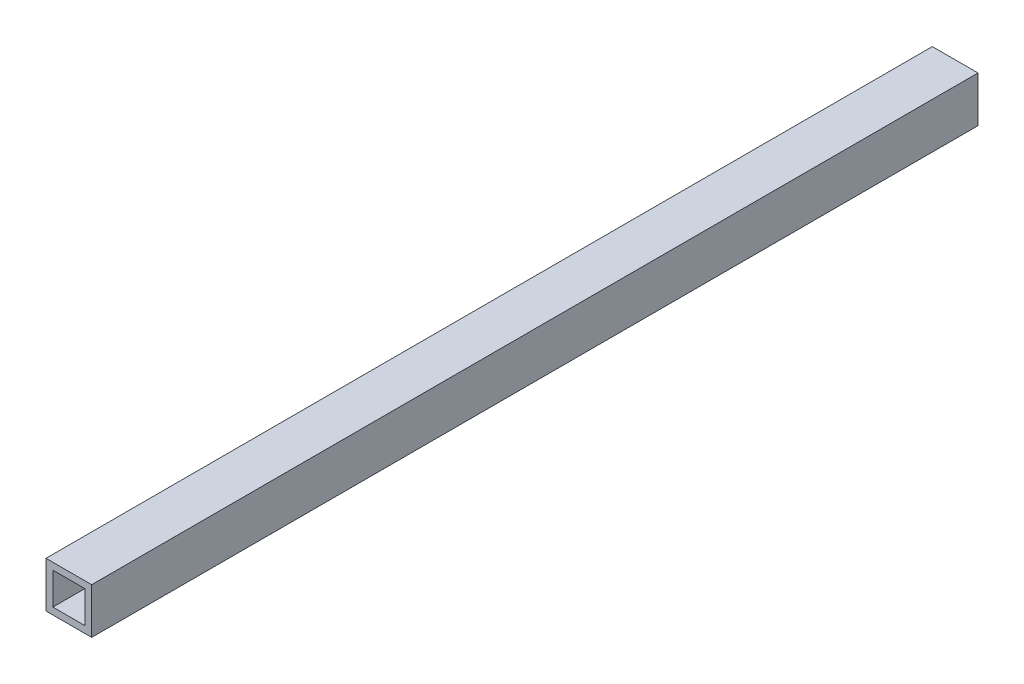
ISO-10303-21;
HEADER;
FILE_DESCRIPTION(('STEP AP214'),'2;1');
FILE_NAME('part.step','',(''),(''),'','','');
FILE_SCHEMA(('AUTOMOTIVE_DESIGN { 1 0 10303 214 1 1 1 1 }'));
ENDSEC;
DATA;
#1=APPLICATION_CONTEXT('core data for automotive mechanical design processes');
#2=APPLICATION_PROTOCOL_DEFINITION('international standard','automotive_design',2000,#1);
#3=PRODUCT_CONTEXT('',#1,'mechanical');
#4=PRODUCT('Part','Part','',(#3));
#5=PRODUCT_RELATED_PRODUCT_CATEGORY('part','',(#4));
#6=PRODUCT_DEFINITION_FORMATION('','',#4);
#7=PRODUCT_DEFINITION_CONTEXT('part definition',#1,'design');
#8=PRODUCT_DEFINITION('design','',#6,#7);
#9=PRODUCT_DEFINITION_SHAPE('','',#8);
#10=(LENGTH_UNIT() NAMED_UNIT(*) SI_UNIT(.MILLI.,.METRE.));
#11=(NAMED_UNIT(*) PLANE_ANGLE_UNIT() SI_UNIT($,.RADIAN.));
#12=(NAMED_UNIT(*) SI_UNIT($,.STERADIAN.) SOLID_ANGLE_UNIT());
#13=UNCERTAINTY_MEASURE_WITH_UNIT(LENGTH_MEASURE(1.E-05),#10,'distance_accuracy_value','');
#14=(GEOMETRIC_REPRESENTATION_CONTEXT(3) GLOBAL_UNCERTAINTY_ASSIGNED_CONTEXT((#13)) GLOBAL_UNIT_ASSIGNED_CONTEXT((#10,
#11,#12)) REPRESENTATION_CONTEXT('',''));
#15=CARTESIAN_POINT('',(0.,0.,0.));
#16=DIRECTION('',(0.,0.,1.));
#17=DIRECTION('',(1.,0.,0.));
#18=AXIS2_PLACEMENT_3D('',#15,#16,#17);
#19=CARTESIAN_POINT('',(0.,0.,194.));
#20=DIRECTION('',(0.,0.,1.));
#21=DIRECTION('',(1.,0.,0.));
#22=AXIS2_PLACEMENT_3D('',#19,#20,#21);
#23=PLANE('',#22);
#24=DIRECTION('',(0.,1.,0.));
#25=VECTOR('',#24,1.);
#26=CARTESIAN_POINT('',(5.,5.,194.));
#27=LINE('',#26,#25);
#28=CARTESIAN_POINT('',(5.,-5.,194.));
#29=VERTEX_POINT('',#28);
#30=CARTESIAN_POINT('',(5.,5.,194.));
#31=VERTEX_POINT('',#30);
#32=EDGE_CURVE('E136',#29,#31,#27,.T.);
#33=ORIENTED_EDGE('',*,*,#32,.T.);
#34=DIRECTION('',(-1.,0.,0.));
#35=VECTOR('',#34,1.);
#36=CARTESIAN_POINT('',(-5.,5.,194.));
#37=LINE('',#36,#35);
#38=CARTESIAN_POINT('',(-5.,5.,194.));
#39=VERTEX_POINT('',#38);
#40=EDGE_CURVE('E139',#31,#39,#37,.T.);
#41=ORIENTED_EDGE('',*,*,#40,.T.);
#42=DIRECTION('',(0.,-1.,0.));
#43=VECTOR('',#42,1.);
#44=CARTESIAN_POINT('',(-5.,5.,194.));
#45=LINE('',#44,#43);
#46=CARTESIAN_POINT('',(-5.,-5.,194.));
#47=VERTEX_POINT('',#46);
#48=EDGE_CURVE('E142',#39,#47,#45,.T.);
#49=ORIENTED_EDGE('',*,*,#48,.T.);
#50=DIRECTION('',(1.,0.,0.));
#51=VECTOR('',#50,1.);
#52=CARTESIAN_POINT('',(-5.,-5.,194.));
#53=LINE('',#52,#51);
#54=EDGE_CURVE('E144',#47,#29,#53,.T.);
#55=ORIENTED_EDGE('',*,*,#54,.T.);
#56=EDGE_LOOP('',(#33,#41,#49,#55));
#57=FACE_BOUND('',#56,.T.);
#58=DIRECTION('',(-1.,0.,0.));
#59=VECTOR('',#58,1.);
#60=CARTESIAN_POINT('',(-3.5,3.5,194.));
#61=LINE('',#60,#59);
#62=CARTESIAN_POINT('',(3.5,3.5,194.));
#63=VERTEX_POINT('',#62);
#64=CARTESIAN_POINT('',(-3.5,3.5,194.));
#65=VERTEX_POINT('',#64);
#66=EDGE_CURVE('E108',#63,#65,#61,.T.);
#67=ORIENTED_EDGE('',*,*,#66,.F.);
#68=DIRECTION('',(0.,1.,0.));
#69=VECTOR('',#68,1.);
#70=CARTESIAN_POINT('',(3.5,-3.5,194.));
#71=LINE('',#70,#69);
#72=CARTESIAN_POINT('',(3.5,-3.5,194.));
#73=VERTEX_POINT('',#72);
#74=EDGE_CURVE('E100',#73,#63,#71,.T.);
#75=ORIENTED_EDGE('',*,*,#74,.F.);
#76=DIRECTION('',(1.,0.,0.));
#77=VECTOR('',#76,1.);
#78=CARTESIAN_POINT('',(-3.5,-3.5,194.));
#79=LINE('',#78,#77);
#80=CARTESIAN_POINT('',(-3.5,-3.5,194.));
#81=VERTEX_POINT('',#80);
#82=EDGE_CURVE('E122',#81,#73,#79,.T.);
#83=ORIENTED_EDGE('',*,*,#82,.F.);
#84=DIRECTION('',(0.,-1.,0.));
#85=VECTOR('',#84,1.);
#86=CARTESIAN_POINT('',(-3.5,-3.5,194.));
#87=LINE('',#86,#85);
#88=EDGE_CURVE('E120',#65,#81,#87,.T.);
#89=ORIENTED_EDGE('',*,*,#88,.F.);
#90=EDGE_LOOP('',(#67,#75,#83,#89));
#91=FACE_BOUND('',#90,.T.);
#92=ADVANCED_FACE('F35',(#57,#91),#23,.T.);
#93=CARTESIAN_POINT('',(0.,0.,0.));
#94=DIRECTION('',(0.,0.,1.));
#95=DIRECTION('',(1.,0.,0.));
#96=AXIS2_PLACEMENT_3D('',#93,#94,#95);
#97=PLANE('',#96);
#98=DIRECTION('',(0.,1.,0.));
#99=VECTOR('',#98,1.);
#100=CARTESIAN_POINT('',(5.,5.,0.));
#101=LINE('',#100,#99);
#102=CARTESIAN_POINT('',(5.,-5.,0.));
#103=VERTEX_POINT('',#102);
#104=CARTESIAN_POINT('',(5.,5.,0.));
#105=VERTEX_POINT('',#104);
#106=EDGE_CURVE('E116',#103,#105,#101,.T.);
#107=ORIENTED_EDGE('',*,*,#106,.F.);
#108=DIRECTION('',(1.,0.,0.));
#109=VECTOR('',#108,1.);
#110=CARTESIAN_POINT('',(-5.,-5.,0.));
#111=LINE('',#110,#109);
#112=CARTESIAN_POINT('',(-5.,-5.,0.));
#113=VERTEX_POINT('',#112);
#114=EDGE_CURVE('E140',#113,#103,#111,.T.);
#115=ORIENTED_EDGE('',*,*,#114,.F.);
#116=DIRECTION('',(0.,-1.,0.));
#117=VECTOR('',#116,1.);
#118=CARTESIAN_POINT('',(-5.,5.,0.));
#119=LINE('',#118,#117);
#120=CARTESIAN_POINT('',(-5.,5.,0.));
#121=VERTEX_POINT('',#120);
#122=EDGE_CURVE('E151',#121,#113,#119,.T.);
#123=ORIENTED_EDGE('',*,*,#122,.F.);
#124=DIRECTION('',(-1.,0.,0.));
#125=VECTOR('',#124,1.);
#126=CARTESIAN_POINT('',(-5.,5.,0.));
#127=LINE('',#126,#125);
#128=EDGE_CURVE('E149',#105,#121,#127,.T.);
#129=ORIENTED_EDGE('',*,*,#128,.F.);
#130=EDGE_LOOP('',(#107,#115,#123,#129));
#131=FACE_BOUND('',#130,.T.);
#132=DIRECTION('',(0.,1.,0.));
#133=VECTOR('',#132,1.);
#134=CARTESIAN_POINT('',(3.5,-3.5,0.));
#135=LINE('',#134,#133);
#136=CARTESIAN_POINT('',(3.5,-3.5,0.));
#137=VERTEX_POINT('',#136);
#138=CARTESIAN_POINT('',(3.5,3.5,0.));
#139=VERTEX_POINT('',#138);
#140=EDGE_CURVE('E58',#137,#139,#135,.T.);
#141=ORIENTED_EDGE('',*,*,#140,.T.);
#142=DIRECTION('',(-1.,0.,0.));
#143=VECTOR('',#142,1.);
#144=CARTESIAN_POINT('',(-3.5,3.5,0.));
#145=LINE('',#144,#143);
#146=CARTESIAN_POINT('',(-3.5,3.5,0.));
#147=VERTEX_POINT('',#146);
#148=EDGE_CURVE('E115',#139,#147,#145,.T.);
#149=ORIENTED_EDGE('',*,*,#148,.T.);
#150=DIRECTION('',(0.,-1.,0.));
#151=VECTOR('',#150,1.);
#152=CARTESIAN_POINT('',(-3.5,-3.5,0.));
#153=LINE('',#152,#151);
#154=CARTESIAN_POINT('',(-3.5,-3.5,0.));
#155=VERTEX_POINT('',#154);
#156=EDGE_CURVE('E128',#147,#155,#153,.T.);
#157=ORIENTED_EDGE('',*,*,#156,.T.);
#158=DIRECTION('',(1.,0.,0.));
#159=VECTOR('',#158,1.);
#160=CARTESIAN_POINT('',(-3.5,-3.5,0.));
#161=LINE('',#160,#159);
#162=EDGE_CURVE('E109',#155,#137,#161,.T.);
#163=ORIENTED_EDGE('',*,*,#162,.T.);
#164=EDGE_LOOP('',(#141,#149,#157,#163));
#165=FACE_BOUND('',#164,.T.);
#166=ADVANCED_FACE('F169',(#131,#165),#97,.F.);
#167=CARTESIAN_POINT('',(5.,5.,194.));
#168=DIRECTION('',(-1.,0.,0.));
#169=DIRECTION('',(0.,-1.,0.));
#170=AXIS2_PLACEMENT_3D('',#167,#168,#169);
#171=PLANE('',#170);
#172=ORIENTED_EDGE('',*,*,#106,.T.);
#173=DIRECTION('',(0.,0.,-1.));
#174=VECTOR('',#173,1.);
#175=CARTESIAN_POINT('',(5.,5.,194.));
#176=LINE('',#175,#174);
#177=EDGE_CURVE('E11',#31,#105,#176,.T.);
#178=ORIENTED_EDGE('',*,*,#177,.F.);
#179=ORIENTED_EDGE('',*,*,#32,.F.);
#180=DIRECTION('',(0.,0.,-1.));
#181=VECTOR('',#180,1.);
#182=CARTESIAN_POINT('',(5.,-5.,194.));
#183=LINE('',#182,#181);
#184=EDGE_CURVE('E146',#29,#103,#183,.T.);
#185=ORIENTED_EDGE('',*,*,#184,.T.);
#186=EDGE_LOOP('',(#172,#178,#179,#185));
#187=FACE_BOUND('',#186,.T.);
#188=ADVANCED_FACE('F37',(#187),#171,.F.);
#189=CARTESIAN_POINT('',(-5.,5.,194.));
#190=DIRECTION('',(0.,-1.,0.));
#191=DIRECTION('',(0.,0.,-1.));
#192=AXIS2_PLACEMENT_3D('',#189,#190,#191);
#193=PLANE('',#192);
#194=ORIENTED_EDGE('',*,*,#128,.T.);
#195=DIRECTION('',(0.,0.,-1.));
#196=VECTOR('',#195,1.);
#197=CARTESIAN_POINT('',(-5.,5.,194.));
#198=LINE('',#197,#196);
#199=EDGE_CURVE('E43',#39,#121,#198,.T.);
#200=ORIENTED_EDGE('',*,*,#199,.F.);
#201=ORIENTED_EDGE('',*,*,#40,.F.);
#202=ORIENTED_EDGE('',*,*,#177,.T.);
#203=EDGE_LOOP('',(#194,#200,#201,#202));
#204=FACE_BOUND('',#203,.T.);
#205=ADVANCED_FACE('F179',(#204),#193,.F.);
#206=CARTESIAN_POINT('',(-5.,5.,194.));
#207=DIRECTION('',(1.,0.,0.));
#208=DIRECTION('',(0.,1.,0.));
#209=AXIS2_PLACEMENT_3D('',#206,#207,#208);
#210=PLANE('',#209);
#211=ORIENTED_EDGE('',*,*,#122,.T.);
#212=DIRECTION('',(0.,0.,-1.));
#213=VECTOR('',#212,1.);
#214=CARTESIAN_POINT('',(-5.,-5.,194.));
#215=LINE('',#214,#213);
#216=EDGE_CURVE('E156',#47,#113,#215,.T.);
#217=ORIENTED_EDGE('',*,*,#216,.F.);
#218=ORIENTED_EDGE('',*,*,#48,.F.);
#219=ORIENTED_EDGE('',*,*,#199,.T.);
#220=EDGE_LOOP('',(#211,#217,#218,#219));
#221=FACE_BOUND('',#220,.T.);
#222=ADVANCED_FACE('F163',(#221),#210,.F.);
#223=CARTESIAN_POINT('',(-5.,-5.,194.));
#224=DIRECTION('',(0.,1.,0.));
#225=DIRECTION('',(0.,0.,1.));
#226=AXIS2_PLACEMENT_3D('',#223,#224,#225);
#227=PLANE('',#226);
#228=ORIENTED_EDGE('',*,*,#114,.T.);
#229=ORIENTED_EDGE('',*,*,#184,.F.);
#230=ORIENTED_EDGE('',*,*,#54,.F.);
#231=ORIENTED_EDGE('',*,*,#216,.T.);
#232=EDGE_LOOP('',(#228,#229,#230,#231));
#233=FACE_BOUND('',#232,.T.);
#234=ADVANCED_FACE('F173',(#233),#227,.F.);
#235=CARTESIAN_POINT('',(3.5,-3.5,194.));
#236=DIRECTION('',(-1.,0.,0.));
#237=DIRECTION('',(0.,0.,1.));
#238=AXIS2_PLACEMENT_3D('',#235,#236,#237);
#239=PLANE('',#238);
#240=ORIENTED_EDGE('',*,*,#140,.F.);
#241=DIRECTION('',(0.,0.,-1.));
#242=VECTOR('',#241,1.);
#243=CARTESIAN_POINT('',(3.5,-3.5,194.));
#244=LINE('',#243,#242);
#245=EDGE_CURVE('E104',#73,#137,#244,.T.);
#246=ORIENTED_EDGE('',*,*,#245,.F.);
#247=ORIENTED_EDGE('',*,*,#74,.T.);
#248=DIRECTION('',(0.,0.,-1.));
#249=VECTOR('',#248,1.);
#250=CARTESIAN_POINT('',(3.5,3.5,194.));
#251=LINE('',#250,#249);
#252=EDGE_CURVE('E103',#63,#139,#251,.T.);
#253=ORIENTED_EDGE('',*,*,#252,.T.);
#254=EDGE_LOOP('',(#240,#246,#247,#253));
#255=FACE_BOUND('',#254,.T.);
#256=ADVANCED_FACE('F102',(#255),#239,.T.);
#257=CARTESIAN_POINT('',(-3.5,3.5,194.));
#258=DIRECTION('',(0.,-1.,0.));
#259=DIRECTION('',(0.,0.,-1.));
#260=AXIS2_PLACEMENT_3D('',#257,#258,#259);
#261=PLANE('',#260);
#262=ORIENTED_EDGE('',*,*,#148,.F.);
#263=ORIENTED_EDGE('',*,*,#252,.F.);
#264=ORIENTED_EDGE('',*,*,#66,.T.);
#265=DIRECTION('',(0.,0.,-1.));
#266=VECTOR('',#265,1.);
#267=CARTESIAN_POINT('',(-3.5,3.5,194.));
#268=LINE('',#267,#266);
#269=EDGE_CURVE('E117',#65,#147,#268,.T.);
#270=ORIENTED_EDGE('',*,*,#269,.T.);
#271=EDGE_LOOP('',(#262,#263,#264,#270));
#272=FACE_BOUND('',#271,.T.);
#273=ADVANCED_FACE('F112',(#272),#261,.T.);
#274=CARTESIAN_POINT('',(-3.5,-3.5,194.));
#275=DIRECTION('',(1.,0.,0.));
#276=DIRECTION('',(0.,0.,-1.));
#277=AXIS2_PLACEMENT_3D('',#274,#275,#276);
#278=PLANE('',#277);
#279=ORIENTED_EDGE('',*,*,#156,.F.);
#280=ORIENTED_EDGE('',*,*,#269,.F.);
#281=ORIENTED_EDGE('',*,*,#88,.T.);
#282=DIRECTION('',(0.,0.,-1.));
#283=VECTOR('',#282,1.);
#284=CARTESIAN_POINT('',(-3.5,-3.5,194.));
#285=LINE('',#284,#283);
#286=EDGE_CURVE('E50',#81,#155,#285,.T.);
#287=ORIENTED_EDGE('',*,*,#286,.T.);
#288=EDGE_LOOP('',(#279,#280,#281,#287));
#289=FACE_BOUND('',#288,.T.);
#290=ADVANCED_FACE('F202',(#289),#278,.T.);
#291=CARTESIAN_POINT('',(-3.5,-3.5,194.));
#292=DIRECTION('',(0.,1.,0.));
#293=DIRECTION('',(0.,0.,1.));
#294=AXIS2_PLACEMENT_3D('',#291,#292,#293);
#295=PLANE('',#294);
#296=ORIENTED_EDGE('',*,*,#162,.F.);
#297=ORIENTED_EDGE('',*,*,#286,.F.);
#298=ORIENTED_EDGE('',*,*,#82,.T.);
#299=ORIENTED_EDGE('',*,*,#245,.T.);
#300=EDGE_LOOP('',(#296,#297,#298,#299));
#301=FACE_BOUND('',#300,.T.);
#302=ADVANCED_FACE('F206',(#301),#295,.T.);
#303=CLOSED_SHELL('',(#92,#166,#188,#205,#222,#234,#256,#273,#290,#302));
#304=MANIFOLD_SOLID_BREP('B2',#303);
#305=ADVANCED_BREP_SHAPE_REPRESENTATION('',(#18,#304),#14);
#306=SHAPE_DEFINITION_REPRESENTATION(#9,#305);
ENDSEC;
END-ISO-10303-21;
